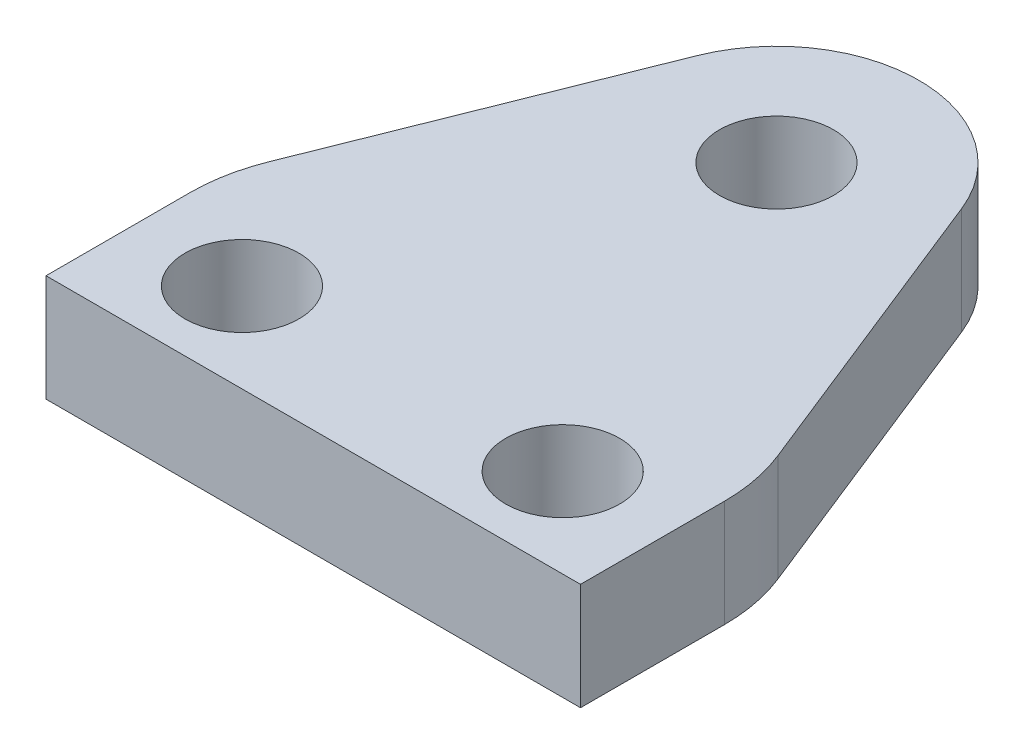
ISO-10303-21;
HEADER;
FILE_DESCRIPTION(('STEP AP214'),'2;1');
FILE_NAME('part.step','',(''),(''),'','','');
FILE_SCHEMA(('AUTOMOTIVE_DESIGN { 1 0 10303 214 1 1 1 1 }'));
ENDSEC;
DATA;
#1=APPLICATION_CONTEXT('core data for automotive mechanical design processes');
#2=APPLICATION_PROTOCOL_DEFINITION('international standard','automotive_design',2000,#1);
#3=PRODUCT_CONTEXT('',#1,'mechanical');
#4=PRODUCT('Part','Part','',(#3));
#5=PRODUCT_RELATED_PRODUCT_CATEGORY('part','',(#4));
#6=PRODUCT_DEFINITION_FORMATION('','',#4);
#7=PRODUCT_DEFINITION_CONTEXT('part definition',#1,'design');
#8=PRODUCT_DEFINITION('design','',#6,#7);
#9=PRODUCT_DEFINITION_SHAPE('','',#8);
#10=(LENGTH_UNIT() NAMED_UNIT(*) SI_UNIT(.MILLI.,.METRE.));
#11=(NAMED_UNIT(*) PLANE_ANGLE_UNIT() SI_UNIT($,.RADIAN.));
#12=(NAMED_UNIT(*) SI_UNIT($,.STERADIAN.) SOLID_ANGLE_UNIT());
#13=UNCERTAINTY_MEASURE_WITH_UNIT(LENGTH_MEASURE(1.E-05),#10,'distance_accuracy_value','');
#14=(GEOMETRIC_REPRESENTATION_CONTEXT(3) GLOBAL_UNCERTAINTY_ASSIGNED_CONTEXT((#13)) GLOBAL_UNIT_ASSIGNED_CONTEXT((#10,
#11,#12)) REPRESENTATION_CONTEXT('',''));
#15=CARTESIAN_POINT('',(0.,0.,0.));
#16=DIRECTION('',(0.,0.,1.));
#17=DIRECTION('',(1.,0.,0.));
#18=AXIS2_PLACEMENT_3D('',#15,#16,#17);
#19=CARTESIAN_POINT('',(14.6601361854482,3.,-5.85148471663463));
#20=DIRECTION('',(0.92875103057504,0.,-0.3707040911641));
#21=DIRECTION('',(-0.3707040911641,0.,-0.92875103057504));
#22=AXIS2_PLACEMENT_3D('',#19,#20,#21);
#23=PLANE('',#22);
#24=DIRECTION('',(0.3707040911641,0.,0.92875103057504));
#25=VECTOR('',#24,1.);
#26=CARTESIAN_POINT('',(14.6601361854482,3.,-5.85148471663463));
#27=LINE('',#26,#25);
#28=CARTESIAN_POINT('',(11.2150041223002,3.,-14.4828163646564));
#29=VERTEX_POINT('',#28);
#30=CARTESIAN_POINT('',(14.6437551528752,3.,-5.8925252695896));
#31=VERTEX_POINT('',#30);
#32=EDGE_CURVE('E115',#29,#31,#27,.T.);
#33=ORIENTED_EDGE('',*,*,#32,.T.);
#34=DIRECTION('',(0.,-1.,0.));
#35=VECTOR('',#34,1.);
#36=CARTESIAN_POINT('',(14.6437551528752,0.,-5.8925252695896));
#37=LINE('',#36,#35);
#38=CARTESIAN_POINT('',(14.6437551528752,0.,-5.8925252695896));
#39=VERTEX_POINT('',#38);
#40=EDGE_CURVE('E123',#31,#39,#37,.T.);
#41=ORIENTED_EDGE('',*,*,#40,.T.);
#42=DIRECTION('',(0.3707040911641,0.,0.92875103057504));
#43=VECTOR('',#42,1.);
#44=CARTESIAN_POINT('',(14.6601361854482,0.,-5.85148471663463));
#45=LINE('',#44,#43);
#46=CARTESIAN_POINT('',(11.2150041223002,0.,-14.4828163646564));
#47=VERTEX_POINT('',#46);
#48=EDGE_CURVE('E118',#47,#39,#45,.T.);
#49=ORIENTED_EDGE('',*,*,#48,.F.);
#50=DIRECTION('',(0.,-1.,0.));
#51=VECTOR('',#50,1.);
#52=CARTESIAN_POINT('',(11.2150041223002,3.,-14.4828163646564));
#53=LINE('',#52,#51);
#54=EDGE_CURVE('E111',#29,#47,#53,.T.);
#55=ORIENTED_EDGE('',*,*,#54,.F.);
#56=EDGE_LOOP('',(#33,#41,#49,#55));
#57=FACE_BOUND('',#56,.T.);
#58=ADVANCED_FACE('F45',(#57),#23,.T.);
#59=CARTESIAN_POINT('',(7.5,3.,-13.));
#60=DIRECTION('',(0.,-1.,0.));
#61=DIRECTION('',(0.,0.,-1.));
#62=AXIS2_PLACEMENT_3D('',#59,#60,#61);
#63=CYLINDRICAL_SURFACE('',#62,4.);
#64=CARTESIAN_POINT('',(7.5,0.,-13.));
#65=DIRECTION('',(0.,1.,0.));
#66=DIRECTION('',(0.,0.,1.));
#67=AXIS2_PLACEMENT_3D('',#64,#65,#66);
#68=CIRCLE('',#67,4.);
#69=CARTESIAN_POINT('',(3.78499587769984,0.,-14.4828163646564));
#70=VERTEX_POINT('',#69);
#71=EDGE_CURVE('E173',#47,#70,#68,.T.);
#72=ORIENTED_EDGE('',*,*,#71,.T.);
#73=DIRECTION('',(0.,-1.,0.));
#74=VECTOR('',#73,1.);
#75=CARTESIAN_POINT('',(3.78499587769984,3.,-14.4828163646564));
#76=LINE('',#75,#74);
#77=CARTESIAN_POINT('',(3.78499587769984,3.,-14.4828163646564));
#78=VERTEX_POINT('',#77);
#79=EDGE_CURVE('E124',#78,#70,#76,.T.);
#80=ORIENTED_EDGE('',*,*,#79,.F.);
#81=CARTESIAN_POINT('',(7.5,3.,-13.));
#82=DIRECTION('',(0.,1.,0.));
#83=DIRECTION('',(0.,0.,1.));
#84=AXIS2_PLACEMENT_3D('',#81,#82,#83);
#85=CIRCLE('',#84,4.);
#86=EDGE_CURVE('E128',#29,#78,#85,.T.);
#87=ORIENTED_EDGE('',*,*,#86,.F.);
#88=ORIENTED_EDGE('',*,*,#54,.T.);
#89=EDGE_LOOP('',(#72,#80,#87,#88));
#90=FACE_BOUND('',#89,.T.);
#91=ADVANCED_FACE('F129',(#90),#63,.T.);
#92=CARTESIAN_POINT('',(-1.72145903353521,3.,-0.687107616029006));
#93=DIRECTION('',(-0.92875103057504,0.,-0.3707040911641));
#94=DIRECTION('',(-0.3707040911641,0.,0.92875103057504));
#95=AXIS2_PLACEMENT_3D('',#92,#93,#94);
#96=PLANE('',#95);
#97=DIRECTION('',(0.3707040911641,0.,-0.92875103057504));
#98=VECTOR('',#97,1.);
#99=CARTESIAN_POINT('',(-1.72145903353521,0.,-0.687107616029006));
#100=LINE('',#99,#98);
#101=CARTESIAN_POINT('',(0.3562448471248,0.,-5.8925252695896));
#102=VERTEX_POINT('',#101);
#103=EDGE_CURVE('E176',#102,#70,#100,.T.);
#104=ORIENTED_EDGE('',*,*,#103,.F.);
#105=DIRECTION('',(0.,-1.,0.));
#106=VECTOR('',#105,1.);
#107=CARTESIAN_POINT('',(0.3562448471248,3.,-5.8925252695896));
#108=LINE('',#107,#106);
#109=CARTESIAN_POINT('',(0.3562448471248,3.,-5.8925252695896));
#110=VERTEX_POINT('',#109);
#111=EDGE_CURVE('E11',#102,#110,#108,.F.);
#112=ORIENTED_EDGE('',*,*,#111,.T.);
#113=DIRECTION('',(0.3707040911641,0.,-0.92875103057504));
#114=VECTOR('',#113,1.);
#115=CARTESIAN_POINT('',(-1.72145903353521,3.,-0.687107616029006));
#116=LINE('',#115,#114);
#117=EDGE_CURVE('E132',#110,#78,#116,.T.);
#118=ORIENTED_EDGE('',*,*,#117,.T.);
#119=ORIENTED_EDGE('',*,*,#79,.T.);
#120=EDGE_LOOP('',(#104,#112,#118,#119));
#121=FACE_BOUND('',#120,.T.);
#122=ADVANCED_FACE('F241',(#121),#96,.T.);
#123=CARTESIAN_POINT('',(0.,3.,0.));
#124=DIRECTION('',(-1.,0.,0.));
#125=DIRECTION('',(0.,0.,1.));
#126=AXIS2_PLACEMENT_3D('',#123,#124,#125);
#127=PLANE('',#126);
#128=DIRECTION('',(0.,0.,-1.));
#129=VECTOR('',#128,1.);
#130=CARTESIAN_POINT('',(0.,3.,0.));
#131=LINE('',#130,#129);
#132=CARTESIAN_POINT('',(0.,3.,0.));
#133=VERTEX_POINT('',#132);
#134=CARTESIAN_POINT('',(0.,3.,-4.0390048137691));
#135=VERTEX_POINT('',#134);
#136=EDGE_CURVE('E149',#133,#135,#131,.T.);
#137=ORIENTED_EDGE('',*,*,#136,.T.);
#138=DIRECTION('',(0.,-1.,0.));
#139=VECTOR('',#138,1.);
#140=CARTESIAN_POINT('',(0.,3.,-4.0390048137691));
#141=LINE('',#140,#139);
#142=CARTESIAN_POINT('',(0.,0.,-4.0390048137691));
#143=VERTEX_POINT('',#142);
#144=EDGE_CURVE('E54',#135,#143,#141,.T.);
#145=ORIENTED_EDGE('',*,*,#144,.T.);
#146=DIRECTION('',(0.,0.,-1.));
#147=VECTOR('',#146,1.);
#148=CARTESIAN_POINT('',(0.,0.,0.));
#149=LINE('',#148,#147);
#150=CARTESIAN_POINT('',(0.,0.,0.));
#151=VERTEX_POINT('',#150);
#152=EDGE_CURVE('E179',#151,#143,#149,.T.);
#153=ORIENTED_EDGE('',*,*,#152,.F.);
#154=DIRECTION('',(0.,-1.,0.));
#155=VECTOR('',#154,1.);
#156=CARTESIAN_POINT('',(0.,3.,0.));
#157=LINE('',#156,#155);
#158=EDGE_CURVE('E200',#133,#151,#157,.T.);
#159=ORIENTED_EDGE('',*,*,#158,.F.);
#160=EDGE_LOOP('',(#137,#145,#153,#159));
#161=FACE_BOUND('',#160,.T.);
#162=ADVANCED_FACE('F224',(#161),#127,.T.);
#163=CARTESIAN_POINT('',(0.,3.,0.));
#164=DIRECTION('',(0.,0.,-1.));
#165=DIRECTION('',(-1.,0.,0.));
#166=AXIS2_PLACEMENT_3D('',#163,#164,#165);
#167=PLANE('',#166);
#168=DIRECTION('',(1.,0.,0.));
#169=VECTOR('',#168,1.);
#170=CARTESIAN_POINT('',(0.,0.,0.));
#171=LINE('',#170,#169);
#172=CARTESIAN_POINT('',(15.,0.,0.));
#173=VERTEX_POINT('',#172);
#174=EDGE_CURVE('E183',#151,#173,#171,.T.);
#175=ORIENTED_EDGE('',*,*,#174,.T.);
#176=DIRECTION('',(0.,-1.,0.));
#177=VECTOR('',#176,1.);
#178=CARTESIAN_POINT('',(15.,3.,0.));
#179=LINE('',#178,#177);
#180=CARTESIAN_POINT('',(15.,3.,0.));
#181=VERTEX_POINT('',#180);
#182=EDGE_CURVE('E170',#181,#173,#179,.T.);
#183=ORIENTED_EDGE('',*,*,#182,.F.);
#184=DIRECTION('',(1.,0.,0.));
#185=VECTOR('',#184,1.);
#186=CARTESIAN_POINT('',(0.,3.,0.));
#187=LINE('',#186,#185);
#188=EDGE_CURVE('E152',#133,#181,#187,.T.);
#189=ORIENTED_EDGE('',*,*,#188,.F.);
#190=ORIENTED_EDGE('',*,*,#158,.T.);
#191=EDGE_LOOP('',(#175,#183,#189,#190));
#192=FACE_BOUND('',#191,.T.);
#193=ADVANCED_FACE('F233',(#192),#167,.F.);
#194=CARTESIAN_POINT('',(3.,3.,-2.5));
#195=DIRECTION('',(0.,-1.,0.));
#196=DIRECTION('',(0.,0.,-1.));
#197=AXIS2_PLACEMENT_3D('',#194,#195,#196);
#198=CYLINDRICAL_SURFACE('',#197,1.6);
#199=CARTESIAN_POINT('',(3.,3.,-2.5));
#200=DIRECTION('',(0.,1.,0.));
#201=DIRECTION('',(0.,0.,1.));
#202=AXIS2_PLACEMENT_3D('',#199,#200,#201);
#203=CIRCLE('',#202,1.6);
#204=CARTESIAN_POINT('',(3.,3.,-0.9));
#205=VERTEX_POINT('',#204);
#206=EDGE_CURVE('E162',#205,#205,#203,.T.);
#207=ORIENTED_EDGE('',*,*,#206,.T.);
#208=EDGE_LOOP('',(#207));
#209=FACE_BOUND('',#208,.T.);
#210=CARTESIAN_POINT('',(3.,0.,-2.5));
#211=DIRECTION('',(0.,1.,0.));
#212=DIRECTION('',(0.,0.,1.));
#213=AXIS2_PLACEMENT_3D('',#210,#211,#212);
#214=CIRCLE('',#213,1.6);
#215=CARTESIAN_POINT('',(3.,0.,-0.9));
#216=VERTEX_POINT('',#215);
#217=EDGE_CURVE('E144',#216,#216,#214,.T.);
#218=ORIENTED_EDGE('',*,*,#217,.F.);
#219=EDGE_LOOP('',(#218));
#220=FACE_BOUND('',#219,.T.);
#221=ADVANCED_FACE('F259',(#209,#220),#198,.F.);
#222=CARTESIAN_POINT('',(12.,3.,-2.5));
#223=DIRECTION('',(0.,-1.,0.));
#224=DIRECTION('',(0.,0.,-1.));
#225=AXIS2_PLACEMENT_3D('',#222,#223,#224);
#226=CYLINDRICAL_SURFACE('',#225,1.6);
#227=CARTESIAN_POINT('',(12.,3.,-2.5));
#228=DIRECTION('',(0.,1.,0.));
#229=DIRECTION('',(0.,0.,1.));
#230=AXIS2_PLACEMENT_3D('',#227,#228,#229);
#231=CIRCLE('',#230,1.6);
#232=CARTESIAN_POINT('',(12.,3.,-0.899999999999998));
#233=VERTEX_POINT('',#232);
#234=EDGE_CURVE('E158',#233,#233,#231,.T.);
#235=ORIENTED_EDGE('',*,*,#234,.T.);
#236=EDGE_LOOP('',(#235));
#237=FACE_BOUND('',#236,.T.);
#238=CARTESIAN_POINT('',(12.,0.,-2.5));
#239=DIRECTION('',(0.,1.,0.));
#240=DIRECTION('',(0.,0.,1.));
#241=AXIS2_PLACEMENT_3D('',#238,#239,#240);
#242=CIRCLE('',#241,1.6);
#243=CARTESIAN_POINT('',(12.,0.,-0.899999999999998));
#244=VERTEX_POINT('',#243);
#245=EDGE_CURVE('E190',#244,#244,#242,.T.);
#246=ORIENTED_EDGE('',*,*,#245,.F.);
#247=EDGE_LOOP('',(#246));
#248=FACE_BOUND('',#247,.T.);
#249=ADVANCED_FACE('F263',(#237,#248),#226,.F.);
#250=CARTESIAN_POINT('',(15.,3.,0.));
#251=DIRECTION('',(-1.,0.,0.));
#252=DIRECTION('',(0.,0.,1.));
#253=AXIS2_PLACEMENT_3D('',#250,#251,#252);
#254=PLANE('',#253);
#255=DIRECTION('',(0.,0.,-1.));
#256=VECTOR('',#255,1.);
#257=CARTESIAN_POINT('',(15.,0.,0.));
#258=LINE('',#257,#256);
#259=CARTESIAN_POINT('',(15.,0.,-4.0390048137691));
#260=VERTEX_POINT('',#259);
#261=EDGE_CURVE('E186',#173,#260,#258,.T.);
#262=ORIENTED_EDGE('',*,*,#261,.T.);
#263=DIRECTION('',(0.,-1.,0.));
#264=VECTOR('',#263,1.);
#265=CARTESIAN_POINT('',(15.,3.,-4.0390048137691));
#266=LINE('',#265,#264);
#267=CARTESIAN_POINT('',(15.,3.,-4.0390048137691));
#268=VERTEX_POINT('',#267);
#269=EDGE_CURVE('E213',#260,#268,#266,.F.);
#270=ORIENTED_EDGE('',*,*,#269,.T.);
#271=DIRECTION('',(0.,0.,-1.));
#272=VECTOR('',#271,1.);
#273=CARTESIAN_POINT('',(15.,3.,0.));
#274=LINE('',#273,#272);
#275=EDGE_CURVE('E155',#181,#268,#274,.T.);
#276=ORIENTED_EDGE('',*,*,#275,.F.);
#277=ORIENTED_EDGE('',*,*,#182,.T.);
#278=EDGE_LOOP('',(#262,#270,#276,#277));
#279=FACE_BOUND('',#278,.T.);
#280=ADVANCED_FACE('F237',(#279),#254,.F.);
#281=CARTESIAN_POINT('',(7.5,3.,-13.));
#282=DIRECTION('',(0.,-1.,0.));
#283=DIRECTION('',(0.,0.,-1.));
#284=AXIS2_PLACEMENT_3D('',#281,#282,#283);
#285=CYLINDRICAL_SURFACE('',#284,1.6);
#286=CARTESIAN_POINT('',(7.5,3.,-13.));
#287=DIRECTION('',(0.,1.,0.));
#288=DIRECTION('',(0.,0.,1.));
#289=AXIS2_PLACEMENT_3D('',#286,#287,#288);
#290=CIRCLE('',#289,1.6);
#291=CARTESIAN_POINT('',(7.5,3.,-11.4));
#292=VERTEX_POINT('',#291);
#293=EDGE_CURVE('E166',#292,#292,#290,.T.);
#294=ORIENTED_EDGE('',*,*,#293,.T.);
#295=EDGE_LOOP('',(#294));
#296=FACE_BOUND('',#295,.T.);
#297=CARTESIAN_POINT('',(7.5,0.,-13.));
#298=DIRECTION('',(0.,1.,0.));
#299=DIRECTION('',(0.,0.,1.));
#300=AXIS2_PLACEMENT_3D('',#297,#298,#299);
#301=CIRCLE('',#300,1.6);
#302=CARTESIAN_POINT('',(7.5,0.,-11.4));
#303=VERTEX_POINT('',#302);
#304=EDGE_CURVE('E140',#303,#303,#301,.T.);
#305=ORIENTED_EDGE('',*,*,#304,.F.);
#306=EDGE_LOOP('',(#305));
#307=FACE_BOUND('',#306,.T.);
#308=ADVANCED_FACE('F262',(#296,#307),#285,.F.);
#309=CARTESIAN_POINT('',(0.,3.,0.));
#310=DIRECTION('',(0.,1.,0.));
#311=DIRECTION('',(0.,0.,1.));
#312=AXIS2_PLACEMENT_3D('',#309,#310,#311);
#313=PLANE('',#312);
#314=ORIENTED_EDGE('',*,*,#275,.T.);
#315=CARTESIAN_POINT('',(10.,3.,-4.0390048137691));
#316=DIRECTION('',(0.,1.,0.));
#317=DIRECTION('',(0.,0.,1.));
#318=AXIS2_PLACEMENT_3D('',#315,#316,#317);
#319=CIRCLE('',#318,5.);
#320=EDGE_CURVE('E138',#268,#31,#319,.T.);
#321=ORIENTED_EDGE('',*,*,#320,.T.);
#322=ORIENTED_EDGE('',*,*,#32,.F.);
#323=ORIENTED_EDGE('',*,*,#86,.T.);
#324=ORIENTED_EDGE('',*,*,#117,.F.);
#325=CARTESIAN_POINT('',(5.,3.,-4.0390048137691));
#326=DIRECTION('',(0.,1.,0.));
#327=DIRECTION('',(0.,0.,1.));
#328=AXIS2_PLACEMENT_3D('',#325,#326,#327);
#329=CIRCLE('',#328,5.);
#330=EDGE_CURVE('E61',#110,#135,#329,.T.);
#331=ORIENTED_EDGE('',*,*,#330,.T.);
#332=ORIENTED_EDGE('',*,*,#136,.F.);
#333=ORIENTED_EDGE('',*,*,#188,.T.);
#334=EDGE_LOOP('',(#314,#321,#322,#323,#324,#331,#332,#333));
#335=FACE_BOUND('',#334,.T.);
#336=ORIENTED_EDGE('',*,*,#234,.F.);
#337=EDGE_LOOP('',(#336));
#338=FACE_BOUND('',#337,.T.);
#339=ORIENTED_EDGE('',*,*,#206,.F.);
#340=EDGE_LOOP('',(#339));
#341=FACE_BOUND('',#340,.T.);
#342=ORIENTED_EDGE('',*,*,#293,.F.);
#343=EDGE_LOOP('',(#342));
#344=FACE_BOUND('',#343,.T.);
#345=ADVANCED_FACE('F135',(#335,#338,#341,#344),#313,.T.);
#346=CARTESIAN_POINT('',(0.,0.,0.));
#347=DIRECTION('',(0.,1.,0.));
#348=DIRECTION('',(0.,0.,1.));
#349=AXIS2_PLACEMENT_3D('',#346,#347,#348);
#350=PLANE('',#349);
#351=ORIENTED_EDGE('',*,*,#48,.T.);
#352=CARTESIAN_POINT('',(10.,0.,-4.0390048137691));
#353=DIRECTION('',(0.,1.,0.));
#354=DIRECTION('',(0.,0.,1.));
#355=AXIS2_PLACEMENT_3D('',#352,#353,#354);
#356=CIRCLE('',#355,5.);
#357=EDGE_CURVE('E210',#39,#260,#356,.F.);
#358=ORIENTED_EDGE('',*,*,#357,.T.);
#359=ORIENTED_EDGE('',*,*,#261,.F.);
#360=ORIENTED_EDGE('',*,*,#174,.F.);
#361=ORIENTED_EDGE('',*,*,#152,.T.);
#362=CARTESIAN_POINT('',(5.,0.,-4.0390048137691));
#363=DIRECTION('',(0.,1.,0.));
#364=DIRECTION('',(0.,0.,1.));
#365=AXIS2_PLACEMENT_3D('',#362,#363,#364);
#366=CIRCLE('',#365,5.);
#367=EDGE_CURVE('E207',#143,#102,#366,.F.);
#368=ORIENTED_EDGE('',*,*,#367,.T.);
#369=ORIENTED_EDGE('',*,*,#103,.T.);
#370=ORIENTED_EDGE('',*,*,#71,.F.);
#371=EDGE_LOOP('',(#351,#358,#359,#360,#361,#368,#369,#370));
#372=FACE_BOUND('',#371,.T.);
#373=ORIENTED_EDGE('',*,*,#245,.T.);
#374=EDGE_LOOP('',(#373));
#375=FACE_BOUND('',#374,.T.);
#376=ORIENTED_EDGE('',*,*,#217,.T.);
#377=EDGE_LOOP('',(#376));
#378=FACE_BOUND('',#377,.T.);
#379=ORIENTED_EDGE('',*,*,#304,.T.);
#380=EDGE_LOOP('',(#379));
#381=FACE_BOUND('',#380,.T.);
#382=ADVANCED_FACE('F228',(#372,#375,#378,#381),#350,.F.);
#383=CARTESIAN_POINT('',(10.,3.,-4.0390048137691));
#384=DIRECTION('',(0.,1.,0.));
#385=DIRECTION('',(0.,0.,1.));
#386=AXIS2_PLACEMENT_3D('',#383,#384,#385);
#387=CYLINDRICAL_SURFACE('',#386,5.);
#388=ORIENTED_EDGE('',*,*,#320,.F.);
#389=ORIENTED_EDGE('',*,*,#269,.F.);
#390=ORIENTED_EDGE('',*,*,#357,.F.);
#391=ORIENTED_EDGE('',*,*,#40,.F.);
#392=EDGE_LOOP('',(#388,#389,#390,#391));
#393=FACE_BOUND('',#392,.T.);
#394=ADVANCED_FACE('F240',(#393),#387,.T.);
#395=CARTESIAN_POINT('',(5.,3.,-4.0390048137691));
#396=DIRECTION('',(0.,-1.,0.));
#397=DIRECTION('',(0.,0.,-1.));
#398=AXIS2_PLACEMENT_3D('',#395,#396,#397);
#399=CYLINDRICAL_SURFACE('',#398,5.);
#400=ORIENTED_EDGE('',*,*,#330,.F.);
#401=ORIENTED_EDGE('',*,*,#111,.F.);
#402=ORIENTED_EDGE('',*,*,#367,.F.);
#403=ORIENTED_EDGE('',*,*,#144,.F.);
#404=EDGE_LOOP('',(#400,#401,#402,#403));
#405=FACE_BOUND('',#404,.T.);
#406=ADVANCED_FACE('F47',(#405),#399,.T.);
#407=CLOSED_SHELL('',(#58,#91,#122,#162,#193,#221,#249,#280,#308,#345,#382,#394,#406));
#408=MANIFOLD_SOLID_BREP('B2',#407);
#409=ADVANCED_BREP_SHAPE_REPRESENTATION('',(#18,#408),#14);
#410=SHAPE_DEFINITION_REPRESENTATION(#9,#409);
ENDSEC;
END-ISO-10303-21;
